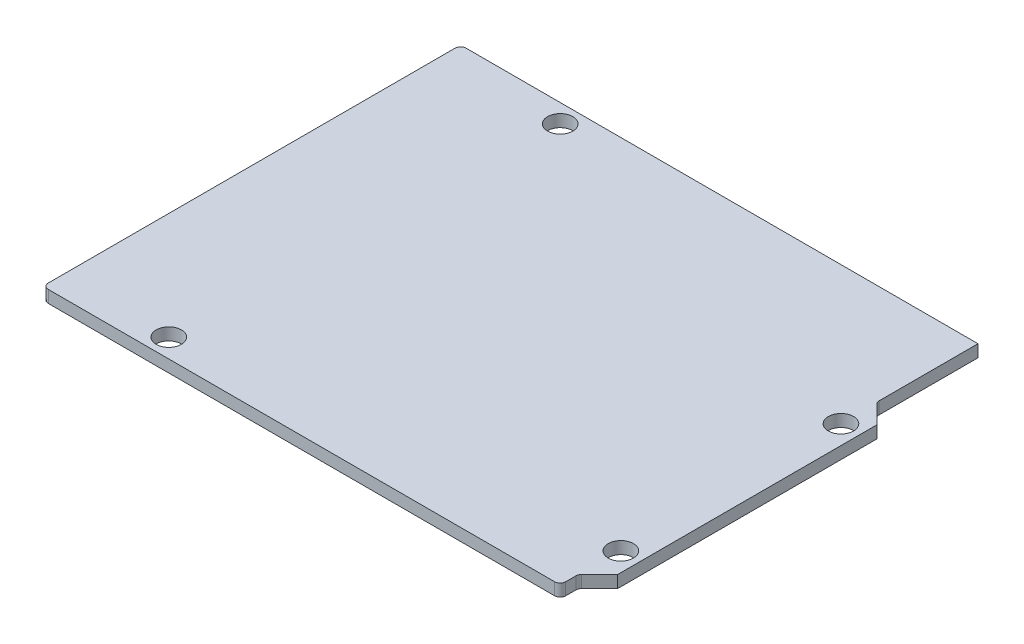
ISO-10303-21;
HEADER;
FILE_DESCRIPTION(('STEP AP214'),'2;1');
FILE_NAME('part.step','',(''),(''),'','','');
FILE_SCHEMA(('AUTOMOTIVE_DESIGN { 1 0 10303 214 1 1 1 1 }'));
ENDSEC;
DATA;
#1=APPLICATION_CONTEXT('core data for automotive mechanical design processes');
#2=APPLICATION_PROTOCOL_DEFINITION('international standard','automotive_design',2000,#1);
#3=PRODUCT_CONTEXT('',#1,'mechanical');
#4=PRODUCT('Part','Part','',(#3));
#5=PRODUCT_RELATED_PRODUCT_CATEGORY('part','',(#4));
#6=PRODUCT_DEFINITION_FORMATION('','',#4);
#7=PRODUCT_DEFINITION_CONTEXT('part definition',#1,'design');
#8=PRODUCT_DEFINITION('design','',#6,#7);
#9=PRODUCT_DEFINITION_SHAPE('','',#8);
#10=(LENGTH_UNIT() NAMED_UNIT(*) SI_UNIT(.MILLI.,.METRE.));
#11=(NAMED_UNIT(*) PLANE_ANGLE_UNIT() SI_UNIT($,.RADIAN.));
#12=(NAMED_UNIT(*) SI_UNIT($,.STERADIAN.) SOLID_ANGLE_UNIT());
#13=UNCERTAINTY_MEASURE_WITH_UNIT(LENGTH_MEASURE(1.E-05),#10,'distance_accuracy_value','');
#14=(GEOMETRIC_REPRESENTATION_CONTEXT(3) GLOBAL_UNCERTAINTY_ASSIGNED_CONTEXT((#13)) GLOBAL_UNIT_ASSIGNED_CONTEXT((#10,
#11,#12)) REPRESENTATION_CONTEXT('',''));
#15=CARTESIAN_POINT('',(0.,0.,0.));
#16=DIRECTION('',(0.,0.,1.));
#17=DIRECTION('',(1.,0.,0.));
#18=AXIS2_PLACEMENT_3D('',#15,#16,#17);
#19=CARTESIAN_POINT('',(0.,1.55,0.));
#20=DIRECTION('',(0.,-1.,0.));
#21=DIRECTION('',(0.,0.,-1.));
#22=AXIS2_PLACEMENT_3D('',#19,#20,#21);
#23=PLANE('',#22);
#24=CARTESIAN_POINT('',(65.8,1.55,-7.6));
#25=DIRECTION('',(0.,1.,0.));
#26=DIRECTION('',(0.,0.,1.));
#27=AXIS2_PLACEMENT_3D('',#24,#25,#26);
#28=CIRCLE('',#27,1.60000000000001);
#29=CARTESIAN_POINT('',(65.8,1.55,-9.2));
#30=VERTEX_POINT('',#29);
#31=EDGE_CURVE('E370',#30,#30,#28,.T.);
#32=ORIENTED_EDGE('',*,*,#31,.F.);
#33=EDGE_LOOP('',(#32));
#34=FACE_BOUND('',#33,.T.);
#35=CARTESIAN_POINT('',(15.,1.55,-50.7));
#36=DIRECTION('',(0.,1.,0.));
#37=DIRECTION('',(0.,0.,1.));
#38=AXIS2_PLACEMENT_3D('',#35,#36,#37);
#39=CIRCLE('',#38,1.6);
#40=CARTESIAN_POINT('',(15.,1.55,-52.3));
#41=VERTEX_POINT('',#40);
#42=EDGE_CURVE('E186',#41,#41,#39,.T.);
#43=ORIENTED_EDGE('',*,*,#42,.F.);
#44=EDGE_LOOP('',(#43));
#45=FACE_BOUND('',#44,.T.);
#46=DIRECTION('',(1.,0.,0.));
#47=VECTOR('',#46,1.);
#48=CARTESIAN_POINT('',(0.,1.55,0.));
#49=LINE('',#48,#47);
#50=CARTESIAN_POINT('',(0.7,1.55,0.));
#51=VERTEX_POINT('',#50);
#52=CARTESIAN_POINT('',(65.,1.55,0.));
#53=VERTEX_POINT('',#52);
#54=EDGE_CURVE('E336',#51,#53,#49,.T.);
#55=ORIENTED_EDGE('',*,*,#54,.T.);
#56=CARTESIAN_POINT('',(65.,1.55,-0.7));
#57=DIRECTION('',(0.,-1.,0.));
#58=DIRECTION('',(0.,0.,-1.));
#59=AXIS2_PLACEMENT_3D('',#56,#57,#58);
#60=CIRCLE('',#59,0.7);
#61=CARTESIAN_POINT('',(65.7,1.55,-0.7));
#62=VERTEX_POINT('',#61);
#63=EDGE_CURVE('E252',#53,#62,#60,.F.);
#64=ORIENTED_EDGE('',*,*,#63,.T.);
#65=DIRECTION('',(0.,0.,-1.));
#66=VECTOR('',#65,1.);
#67=CARTESIAN_POINT('',(65.7,1.55,-2.3));
#68=LINE('',#67,#66);
#69=CARTESIAN_POINT('',(65.7,1.55,-2.01005050633884));
#70=VERTEX_POINT('',#69);
#71=EDGE_CURVE('E150',#62,#70,#68,.T.);
#72=ORIENTED_EDGE('',*,*,#71,.T.);
#73=CARTESIAN_POINT('',(66.4,1.55,-2.01005050633884));
#74=DIRECTION('',(0.,-1.,0.));
#75=DIRECTION('',(0.,0.,-1.));
#76=AXIS2_PLACEMENT_3D('',#73,#74,#75);
#77=CIRCLE('',#76,0.7);
#78=CARTESIAN_POINT('',(65.9050252531694,1.55,-2.50502525316943));
#79=VERTEX_POINT('',#78);
#80=EDGE_CURVE('E11',#70,#79,#77,.T.);
#81=ORIENTED_EDGE('',*,*,#80,.T.);
#82=DIRECTION('',(0.707106781186549,0.,-0.707106781186546));
#83=VECTOR('',#82,1.);
#84=CARTESIAN_POINT('',(68.2,1.55,-4.79999999999999));
#85=LINE('',#84,#83);
#86=CARTESIAN_POINT('',(68.2,1.55,-4.79999999999999));
#87=VERTEX_POINT('',#86);
#88=EDGE_CURVE('E136',#79,#87,#85,.T.);
#89=ORIENTED_EDGE('',*,*,#88,.T.);
#90=DIRECTION('',(0.,0.,-1.));
#91=VECTOR('',#90,1.);
#92=CARTESIAN_POINT('',(68.2,1.55,-4.79999999999999));
#93=LINE('',#92,#91);
#94=CARTESIAN_POINT('',(68.2,1.55,-37.7));
#95=VERTEX_POINT('',#94);
#96=EDGE_CURVE('E142',#87,#95,#93,.T.);
#97=ORIENTED_EDGE('',*,*,#96,.T.);
#98=DIRECTION('',(-0.707106781186548,0.,-0.707106781186546));
#99=VECTOR('',#98,1.);
#100=CARTESIAN_POINT('',(65.7,1.55,-40.2));
#101=LINE('',#100,#99);
#102=CARTESIAN_POINT('',(65.9050252531694,1.55,-39.9949747468306));
#103=VERTEX_POINT('',#102);
#104=EDGE_CURVE('E167',#95,#103,#101,.T.);
#105=ORIENTED_EDGE('',*,*,#104,.T.);
#106=CARTESIAN_POINT('',(66.4,1.55,-40.4899494936611));
#107=DIRECTION('',(0.,-1.,0.));
#108=DIRECTION('',(0.,0.,-1.));
#109=AXIS2_PLACEMENT_3D('',#106,#107,#108);
#110=CIRCLE('',#109,0.7);
#111=CARTESIAN_POINT('',(65.7,1.55,-40.4899494936612));
#112=VERTEX_POINT('',#111);
#113=EDGE_CURVE('E265',#103,#112,#110,.T.);
#114=ORIENTED_EDGE('',*,*,#113,.T.);
#115=DIRECTION('',(0.,0.,-1.));
#116=VECTOR('',#115,1.);
#117=CARTESIAN_POINT('',(65.7,1.55,-53.05));
#118=LINE('',#117,#116);
#119=CARTESIAN_POINT('',(65.7,1.55,-53.05));
#120=VERTEX_POINT('',#119);
#121=EDGE_CURVE('E172',#112,#120,#118,.T.);
#122=ORIENTED_EDGE('',*,*,#121,.T.);
#123=DIRECTION('',(-1.,0.,0.));
#124=VECTOR('',#123,1.);
#125=CARTESIAN_POINT('',(0.,1.55,-53.05));
#126=LINE('',#125,#124);
#127=CARTESIAN_POINT('',(0.7,1.55,-53.05));
#128=VERTEX_POINT('',#127);
#129=EDGE_CURVE('E178',#120,#128,#126,.T.);
#130=ORIENTED_EDGE('',*,*,#129,.T.);
#131=CARTESIAN_POINT('',(0.7,1.55,-52.35));
#132=DIRECTION('',(0.,-1.,0.));
#133=DIRECTION('',(0.,0.,-1.));
#134=AXIS2_PLACEMENT_3D('',#131,#132,#133);
#135=CIRCLE('',#134,0.7);
#136=CARTESIAN_POINT('',(0.,1.55,-52.35));
#137=VERTEX_POINT('',#136);
#138=EDGE_CURVE('E249',#128,#137,#135,.F.);
#139=ORIENTED_EDGE('',*,*,#138,.T.);
#140=DIRECTION('',(0.,0.,1.));
#141=VECTOR('',#140,1.);
#142=CARTESIAN_POINT('',(0.,1.55,0.));
#143=LINE('',#142,#141);
#144=CARTESIAN_POINT('',(0.,1.55,-0.7));
#145=VERTEX_POINT('',#144);
#146=EDGE_CURVE('E208',#137,#145,#143,.T.);
#147=ORIENTED_EDGE('',*,*,#146,.T.);
#148=CARTESIAN_POINT('',(0.7,1.55,-0.7));
#149=DIRECTION('',(0.,-1.,0.));
#150=DIRECTION('',(0.,0.,-1.));
#151=AXIS2_PLACEMENT_3D('',#148,#149,#150);
#152=CIRCLE('',#151,0.7);
#153=EDGE_CURVE('E246',#145,#51,#152,.F.);
#154=ORIENTED_EDGE('',*,*,#153,.T.);
#155=EDGE_LOOP('',(#55,#64,#72,#81,#89,#97,#105,#114,#122,#130,#139,#147,#154));
#156=FACE_BOUND('',#155,.T.);
#157=CARTESIAN_POINT('',(13.6,1.55,-2.4));
#158=DIRECTION('',(0.,1.,0.));
#159=DIRECTION('',(0.,0.,1.));
#160=AXIS2_PLACEMENT_3D('',#157,#158,#159);
#161=CIRCLE('',#160,1.6);
#162=CARTESIAN_POINT('',(13.6,1.55,-4.));
#163=VERTEX_POINT('',#162);
#164=EDGE_CURVE('E362',#163,#163,#161,.T.);
#165=ORIENTED_EDGE('',*,*,#164,.F.);
#166=EDGE_LOOP('',(#165));
#167=FACE_BOUND('',#166,.T.);
#168=CARTESIAN_POINT('',(65.8,1.55,-35.55));
#169=DIRECTION('',(0.,1.,0.));
#170=DIRECTION('',(0.,0.,1.));
#171=AXIS2_PLACEMENT_3D('',#168,#169,#170);
#172=CIRCLE('',#171,1.60000000000001);
#173=CARTESIAN_POINT('',(65.8,1.55,-37.15));
#174=VERTEX_POINT('',#173);
#175=EDGE_CURVE('E378',#174,#174,#172,.T.);
#176=ORIENTED_EDGE('',*,*,#175,.F.);
#177=EDGE_LOOP('',(#176));
#178=FACE_BOUND('',#177,.T.);
#179=ADVANCED_FACE('F38',(#34,#45,#156,#167,#178),#23,.F.);
#180=CARTESIAN_POINT('',(0.,0.,0.));
#181=DIRECTION('',(0.,-1.,0.));
#182=DIRECTION('',(0.,0.,-1.));
#183=AXIS2_PLACEMENT_3D('',#180,#181,#182);
#184=PLANE('',#183);
#185=CARTESIAN_POINT('',(65.8,0.,-7.6));
#186=DIRECTION('',(0.,1.,0.));
#187=DIRECTION('',(0.,0.,1.));
#188=AXIS2_PLACEMENT_3D('',#185,#186,#187);
#189=CIRCLE('',#188,1.60000000000001);
#190=CARTESIAN_POINT('',(65.8,0.,-9.2));
#191=VERTEX_POINT('',#190);
#192=EDGE_CURVE('E374',#191,#191,#189,.T.);
#193=ORIENTED_EDGE('',*,*,#192,.T.);
#194=EDGE_LOOP('',(#193));
#195=FACE_BOUND('',#194,.T.);
#196=CARTESIAN_POINT('',(15.,0.,-50.7));
#197=DIRECTION('',(0.,1.,0.));
#198=DIRECTION('',(0.,0.,1.));
#199=AXIS2_PLACEMENT_3D('',#196,#197,#198);
#200=CIRCLE('',#199,1.6);
#201=CARTESIAN_POINT('',(15.,0.,-52.3));
#202=VERTEX_POINT('',#201);
#203=EDGE_CURVE('E358',#202,#202,#200,.T.);
#204=ORIENTED_EDGE('',*,*,#203,.T.);
#205=EDGE_LOOP('',(#204));
#206=FACE_BOUND('',#205,.T.);
#207=DIRECTION('',(0.,0.,-1.));
#208=VECTOR('',#207,1.);
#209=CARTESIAN_POINT('',(65.7,0.,-2.3));
#210=LINE('',#209,#208);
#211=CARTESIAN_POINT('',(65.7,0.,-0.7));
#212=VERTEX_POINT('',#211);
#213=CARTESIAN_POINT('',(65.7,0.,-2.01005050633884));
#214=VERTEX_POINT('',#213);
#215=EDGE_CURVE('E190',#212,#214,#210,.T.);
#216=ORIENTED_EDGE('',*,*,#215,.F.);
#217=CARTESIAN_POINT('',(65.,0.,-0.7));
#218=DIRECTION('',(0.,-1.,0.));
#219=DIRECTION('',(0.,0.,-1.));
#220=AXIS2_PLACEMENT_3D('',#217,#218,#219);
#221=CIRCLE('',#220,0.7);
#222=CARTESIAN_POINT('',(65.,0.,0.));
#223=VERTEX_POINT('',#222);
#224=EDGE_CURVE('E236',#212,#223,#221,.T.);
#225=ORIENTED_EDGE('',*,*,#224,.T.);
#226=DIRECTION('',(1.,0.,0.));
#227=VECTOR('',#226,1.);
#228=CARTESIAN_POINT('',(0.,0.,0.));
#229=LINE('',#228,#227);
#230=CARTESIAN_POINT('',(0.7,0.,0.));
#231=VERTEX_POINT('',#230);
#232=EDGE_CURVE('E185',#231,#223,#229,.T.);
#233=ORIENTED_EDGE('',*,*,#232,.F.);
#234=CARTESIAN_POINT('',(0.7,0.,-0.7));
#235=DIRECTION('',(0.,-1.,0.));
#236=DIRECTION('',(0.,0.,-1.));
#237=AXIS2_PLACEMENT_3D('',#234,#235,#236);
#238=CIRCLE('',#237,0.7);
#239=CARTESIAN_POINT('',(0.,0.,-0.7));
#240=VERTEX_POINT('',#239);
#241=EDGE_CURVE('E230',#231,#240,#238,.T.);
#242=ORIENTED_EDGE('',*,*,#241,.T.);
#243=DIRECTION('',(0.,0.,1.));
#244=VECTOR('',#243,1.);
#245=CARTESIAN_POINT('',(0.,0.,0.));
#246=LINE('',#245,#244);
#247=CARTESIAN_POINT('',(0.,0.,-52.35));
#248=VERTEX_POINT('',#247);
#249=EDGE_CURVE('E182',#248,#240,#246,.T.);
#250=ORIENTED_EDGE('',*,*,#249,.F.);
#251=CARTESIAN_POINT('',(0.7,0.,-52.35));
#252=DIRECTION('',(0.,-1.,0.));
#253=DIRECTION('',(0.,0.,-1.));
#254=AXIS2_PLACEMENT_3D('',#251,#252,#253);
#255=CIRCLE('',#254,0.7);
#256=CARTESIAN_POINT('',(0.7,0.,-53.05));
#257=VERTEX_POINT('',#256);
#258=EDGE_CURVE('E233',#248,#257,#255,.T.);
#259=ORIENTED_EDGE('',*,*,#258,.T.);
#260=DIRECTION('',(-1.,0.,0.));
#261=VECTOR('',#260,1.);
#262=CARTESIAN_POINT('',(0.,0.,-53.05));
#263=LINE('',#262,#261);
#264=CARTESIAN_POINT('',(65.7,0.,-53.05));
#265=VERTEX_POINT('',#264);
#266=EDGE_CURVE('E205',#265,#257,#263,.T.);
#267=ORIENTED_EDGE('',*,*,#266,.F.);
#268=DIRECTION('',(0.,0.,-1.));
#269=VECTOR('',#268,1.);
#270=CARTESIAN_POINT('',(65.7,0.,-53.05));
#271=LINE('',#270,#269);
#272=CARTESIAN_POINT('',(65.7,0.,-40.4899494936612));
#273=VERTEX_POINT('',#272);
#274=EDGE_CURVE('E202',#273,#265,#271,.T.);
#275=ORIENTED_EDGE('',*,*,#274,.F.);
#276=CARTESIAN_POINT('',(66.4,0.,-40.4899494936611));
#277=DIRECTION('',(0.,-1.,0.));
#278=DIRECTION('',(0.,0.,-1.));
#279=AXIS2_PLACEMENT_3D('',#276,#277,#278);
#280=CIRCLE('',#279,0.7);
#281=CARTESIAN_POINT('',(65.9050252531694,0.,-39.9949747468306));
#282=VERTEX_POINT('',#281);
#283=EDGE_CURVE('E263',#273,#282,#280,.F.);
#284=ORIENTED_EDGE('',*,*,#283,.T.);
#285=DIRECTION('',(-0.707106781186548,0.,-0.707106781186546));
#286=VECTOR('',#285,1.);
#287=CARTESIAN_POINT('',(65.7,0.,-40.2));
#288=LINE('',#287,#286);
#289=CARTESIAN_POINT('',(68.2,0.,-37.7));
#290=VERTEX_POINT('',#289);
#291=EDGE_CURVE('E198',#290,#282,#288,.T.);
#292=ORIENTED_EDGE('',*,*,#291,.F.);
#293=DIRECTION('',(0.,0.,-1.));
#294=VECTOR('',#293,1.);
#295=CARTESIAN_POINT('',(68.2,0.,-4.79999999999999));
#296=LINE('',#295,#294);
#297=CARTESIAN_POINT('',(68.2,0.,-4.79999999999999));
#298=VERTEX_POINT('',#297);
#299=EDGE_CURVE('E196',#298,#290,#296,.T.);
#300=ORIENTED_EDGE('',*,*,#299,.F.);
#301=DIRECTION('',(0.707106781186549,0.,-0.707106781186546));
#302=VECTOR('',#301,1.);
#303=CARTESIAN_POINT('',(68.2,0.,-4.79999999999999));
#304=LINE('',#303,#302);
#305=CARTESIAN_POINT('',(65.9050252531694,0.,-2.50502525316943));
#306=VERTEX_POINT('',#305);
#307=EDGE_CURVE('E156',#306,#298,#304,.T.);
#308=ORIENTED_EDGE('',*,*,#307,.F.);
#309=CARTESIAN_POINT('',(66.4,0.,-2.01005050633884));
#310=DIRECTION('',(0.,-1.,0.));
#311=DIRECTION('',(0.,0.,-1.));
#312=AXIS2_PLACEMENT_3D('',#309,#310,#311);
#313=CIRCLE('',#312,0.7);
#314=EDGE_CURVE('E47',#306,#214,#313,.F.);
#315=ORIENTED_EDGE('',*,*,#314,.T.);
#316=EDGE_LOOP('',(#216,#225,#233,#242,#250,#259,#267,#275,#284,#292,#300,#308,#315));
#317=FACE_BOUND('',#316,.T.);
#318=CARTESIAN_POINT('',(13.6,0.,-2.4));
#319=DIRECTION('',(0.,1.,0.));
#320=DIRECTION('',(0.,0.,1.));
#321=AXIS2_PLACEMENT_3D('',#318,#319,#320);
#322=CIRCLE('',#321,1.6);
#323=CARTESIAN_POINT('',(13.6,0.,-4.));
#324=VERTEX_POINT('',#323);
#325=EDGE_CURVE('E366',#324,#324,#322,.T.);
#326=ORIENTED_EDGE('',*,*,#325,.T.);
#327=EDGE_LOOP('',(#326));
#328=FACE_BOUND('',#327,.T.);
#329=CARTESIAN_POINT('',(65.8,0.,-35.55));
#330=DIRECTION('',(0.,1.,0.));
#331=DIRECTION('',(0.,0.,1.));
#332=AXIS2_PLACEMENT_3D('',#329,#330,#331);
#333=CIRCLE('',#332,1.60000000000001);
#334=CARTESIAN_POINT('',(65.8,0.,-37.15));
#335=VERTEX_POINT('',#334);
#336=EDGE_CURVE('E382',#335,#335,#333,.T.);
#337=ORIENTED_EDGE('',*,*,#336,.T.);
#338=EDGE_LOOP('',(#337));
#339=FACE_BOUND('',#338,.T.);
#340=ADVANCED_FACE('F270',(#195,#206,#317,#328,#339),#184,.T.);
#341=CARTESIAN_POINT('',(0.,1.55,0.));
#342=DIRECTION('',(1.,0.,0.));
#343=DIRECTION('',(0.,0.,-1.));
#344=AXIS2_PLACEMENT_3D('',#341,#342,#343);
#345=PLANE('',#344);
#346=ORIENTED_EDGE('',*,*,#146,.F.);
#347=DIRECTION('',(0.,-1.,0.));
#348=VECTOR('',#347,1.);
#349=CARTESIAN_POINT('',(0.,1.55,-52.35));
#350=LINE('',#349,#348);
#351=EDGE_CURVE('E257',#137,#248,#350,.T.);
#352=ORIENTED_EDGE('',*,*,#351,.T.);
#353=ORIENTED_EDGE('',*,*,#249,.T.);
#354=DIRECTION('',(0.,-1.,0.));
#355=VECTOR('',#354,1.);
#356=CARTESIAN_POINT('',(0.,1.55,-0.7));
#357=LINE('',#356,#355);
#358=EDGE_CURVE('E62',#240,#145,#357,.F.);
#359=ORIENTED_EDGE('',*,*,#358,.T.);
#360=EDGE_LOOP('',(#346,#352,#353,#359));
#361=FACE_BOUND('',#360,.T.);
#362=ADVANCED_FACE('F299',(#361),#345,.F.);
#363=CARTESIAN_POINT('',(0.,1.55,0.));
#364=DIRECTION('',(0.,0.,-1.));
#365=DIRECTION('',(-1.,0.,0.));
#366=AXIS2_PLACEMENT_3D('',#363,#364,#365);
#367=PLANE('',#366);
#368=ORIENTED_EDGE('',*,*,#232,.T.);
#369=DIRECTION('',(0.,-1.,0.));
#370=VECTOR('',#369,1.);
#371=CARTESIAN_POINT('',(65.,1.55,0.));
#372=LINE('',#371,#370);
#373=EDGE_CURVE('E243',#223,#53,#372,.F.);
#374=ORIENTED_EDGE('',*,*,#373,.T.);
#375=ORIENTED_EDGE('',*,*,#54,.F.);
#376=DIRECTION('',(0.,-1.,0.));
#377=VECTOR('',#376,1.);
#378=CARTESIAN_POINT('',(0.7,1.55,0.));
#379=LINE('',#378,#377);
#380=EDGE_CURVE('E239',#51,#231,#379,.T.);
#381=ORIENTED_EDGE('',*,*,#380,.T.);
#382=EDGE_LOOP('',(#368,#374,#375,#381));
#383=FACE_BOUND('',#382,.T.);
#384=ADVANCED_FACE('F325',(#383),#367,.F.);
#385=CARTESIAN_POINT('',(65.7,1.55,-2.3));
#386=DIRECTION('',(-1.,0.,0.));
#387=DIRECTION('',(0.,0.,1.));
#388=AXIS2_PLACEMENT_3D('',#385,#386,#387);
#389=PLANE('',#388);
#390=ORIENTED_EDGE('',*,*,#215,.T.);
#391=DIRECTION('',(0.,-1.,0.));
#392=VECTOR('',#391,1.);
#393=CARTESIAN_POINT('',(65.7,1.55,-2.01005050633884));
#394=LINE('',#393,#392);
#395=EDGE_CURVE('E227',#214,#70,#394,.F.);
#396=ORIENTED_EDGE('',*,*,#395,.T.);
#397=ORIENTED_EDGE('',*,*,#71,.F.);
#398=DIRECTION('',(0.,-1.,0.));
#399=VECTOR('',#398,1.);
#400=CARTESIAN_POINT('',(65.7,1.55,-0.7));
#401=LINE('',#400,#399);
#402=EDGE_CURVE('E223',#62,#212,#401,.T.);
#403=ORIENTED_EDGE('',*,*,#402,.T.);
#404=EDGE_LOOP('',(#390,#396,#397,#403));
#405=FACE_BOUND('',#404,.T.);
#406=ADVANCED_FACE('F275',(#405),#389,.F.);
#407=CARTESIAN_POINT('',(68.2,1.55,-4.79999999999999));
#408=DIRECTION('',(-0.707106781186546,0.,-0.707106781186549));
#409=DIRECTION('',(-0.707106781186549,0.,0.707106781186546));
#410=AXIS2_PLACEMENT_3D('',#407,#408,#409);
#411=PLANE('',#410);
#412=ORIENTED_EDGE('',*,*,#88,.F.);
#413=DIRECTION('',(0.,-1.,0.));
#414=VECTOR('',#413,1.);
#415=CARTESIAN_POINT('',(65.9050252531694,0.,-2.50502525316943));
#416=LINE('',#415,#414);
#417=EDGE_CURVE('E220',#79,#306,#416,.T.);
#418=ORIENTED_EDGE('',*,*,#417,.T.);
#419=ORIENTED_EDGE('',*,*,#307,.T.);
#420=DIRECTION('',(0.,-1.,0.));
#421=VECTOR('',#420,1.);
#422=CARTESIAN_POINT('',(68.2,1.55,-4.79999999999999));
#423=LINE('',#422,#421);
#424=EDGE_CURVE('E153',#87,#298,#423,.T.);
#425=ORIENTED_EDGE('',*,*,#424,.F.);
#426=EDGE_LOOP('',(#412,#418,#419,#425));
#427=FACE_BOUND('',#426,.T.);
#428=ADVANCED_FACE('F154',(#427),#411,.F.);
#429=CARTESIAN_POINT('',(68.2,1.55,-4.79999999999999));
#430=DIRECTION('',(-1.,0.,0.));
#431=DIRECTION('',(0.,0.,1.));
#432=AXIS2_PLACEMENT_3D('',#429,#430,#431);
#433=PLANE('',#432);
#434=ORIENTED_EDGE('',*,*,#299,.T.);
#435=DIRECTION('',(0.,-1.,0.));
#436=VECTOR('',#435,1.);
#437=CARTESIAN_POINT('',(68.2,1.55,-37.7));
#438=LINE('',#437,#436);
#439=EDGE_CURVE('E161',#95,#290,#438,.T.);
#440=ORIENTED_EDGE('',*,*,#439,.F.);
#441=ORIENTED_EDGE('',*,*,#96,.F.);
#442=ORIENTED_EDGE('',*,*,#424,.T.);
#443=EDGE_LOOP('',(#434,#440,#441,#442));
#444=FACE_BOUND('',#443,.T.);
#445=ADVANCED_FACE('F163',(#444),#433,.F.);
#446=CARTESIAN_POINT('',(65.7,1.55,-40.2));
#447=DIRECTION('',(-0.707106781186546,0.,0.707106781186549));
#448=DIRECTION('',(0.707106781186549,0.,0.707106781186546));
#449=AXIS2_PLACEMENT_3D('',#446,#447,#448);
#450=PLANE('',#449);
#451=ORIENTED_EDGE('',*,*,#291,.T.);
#452=DIRECTION('',(0.,-1.,0.));
#453=VECTOR('',#452,1.);
#454=CARTESIAN_POINT('',(65.9050252531694,1.55,-39.9949747468306));
#455=LINE('',#454,#453);
#456=EDGE_CURVE('E217',#282,#103,#455,.F.);
#457=ORIENTED_EDGE('',*,*,#456,.T.);
#458=ORIENTED_EDGE('',*,*,#104,.F.);
#459=ORIENTED_EDGE('',*,*,#439,.T.);
#460=EDGE_LOOP('',(#451,#457,#458,#459));
#461=FACE_BOUND('',#460,.T.);
#462=ADVANCED_FACE('F314',(#461),#450,.F.);
#463=CARTESIAN_POINT('',(65.7,1.55,-53.05));
#464=DIRECTION('',(-1.,0.,0.));
#465=DIRECTION('',(0.,0.,1.));
#466=AXIS2_PLACEMENT_3D('',#463,#464,#465);
#467=PLANE('',#466);
#468=ORIENTED_EDGE('',*,*,#121,.F.);
#469=DIRECTION('',(0.,-1.,0.));
#470=VECTOR('',#469,1.);
#471=CARTESIAN_POINT('',(65.7,0.,-40.4899494936611));
#472=LINE('',#471,#470);
#473=EDGE_CURVE('E160',#112,#273,#472,.T.);
#474=ORIENTED_EDGE('',*,*,#473,.T.);
#475=ORIENTED_EDGE('',*,*,#274,.T.);
#476=DIRECTION('',(0.,-1.,0.));
#477=VECTOR('',#476,1.);
#478=CARTESIAN_POINT('',(65.7,1.55,-53.05));
#479=LINE('',#478,#477);
#480=EDGE_CURVE('E181',#120,#265,#479,.T.);
#481=ORIENTED_EDGE('',*,*,#480,.F.);
#482=EDGE_LOOP('',(#468,#474,#475,#481));
#483=FACE_BOUND('',#482,.T.);
#484=ADVANCED_FACE('F311',(#483),#467,.F.);
#485=CARTESIAN_POINT('',(0.,1.55,-53.05));
#486=DIRECTION('',(0.,0.,1.));
#487=DIRECTION('',(1.,0.,0.));
#488=AXIS2_PLACEMENT_3D('',#485,#486,#487);
#489=PLANE('',#488);
#490=ORIENTED_EDGE('',*,*,#266,.T.);
#491=DIRECTION('',(0.,-1.,0.));
#492=VECTOR('',#491,1.);
#493=CARTESIAN_POINT('',(0.7,1.55,-53.05));
#494=LINE('',#493,#492);
#495=EDGE_CURVE('E54',#257,#128,#494,.F.);
#496=ORIENTED_EDGE('',*,*,#495,.T.);
#497=ORIENTED_EDGE('',*,*,#129,.F.);
#498=ORIENTED_EDGE('',*,*,#480,.T.);
#499=EDGE_LOOP('',(#490,#496,#497,#498));
#500=FACE_BOUND('',#499,.T.);
#501=ADVANCED_FACE('F308',(#500),#489,.F.);
#502=CARTESIAN_POINT('',(15.,1.55,-50.7));
#503=DIRECTION('',(0.,-1.,0.));
#504=DIRECTION('',(0.,0.,-1.));
#505=AXIS2_PLACEMENT_3D('',#502,#503,#504);
#506=CYLINDRICAL_SURFACE('',#505,1.6);
#507=CARTESIAN_POINT('',(15.,1.55,-52.3));
#508=CARTESIAN_POINT('',(15.,1.53385416666667,-52.3));
#509=CARTESIAN_POINT('',(15.,1.51770833333333,-52.3));
#510=CARTESIAN_POINT('',(15.,1.48541666666667,-52.3));
#511=CARTESIAN_POINT('',(15.,1.46927083333333,-52.3));
#512=CARTESIAN_POINT('',(15.,1.43697916666667,-52.3));
#513=CARTESIAN_POINT('',(15.,1.42083333333333,-52.3));
#514=CARTESIAN_POINT('',(15.,1.38854166666667,-52.3));
#515=CARTESIAN_POINT('',(15.,1.37239583333333,-52.3));
#516=CARTESIAN_POINT('',(15.,1.34010416666667,-52.3));
#517=CARTESIAN_POINT('',(15.,1.32395833333333,-52.3));
#518=CARTESIAN_POINT('',(15.,1.29166666666667,-52.3));
#519=CARTESIAN_POINT('',(15.,1.27552083333333,-52.3));
#520=CARTESIAN_POINT('',(15.,1.24322916666667,-52.3));
#521=CARTESIAN_POINT('',(15.,1.22708333333333,-52.3));
#522=CARTESIAN_POINT('',(15.,1.19479166666667,-52.3));
#523=CARTESIAN_POINT('',(15.,1.17864583333333,-52.3));
#524=CARTESIAN_POINT('',(15.,1.14635416666667,-52.3));
#525=CARTESIAN_POINT('',(15.,1.13020833333333,-52.3));
#526=CARTESIAN_POINT('',(15.,1.09791666666667,-52.3));
#527=CARTESIAN_POINT('',(15.,1.08177083333333,-52.3));
#528=CARTESIAN_POINT('',(15.,1.04947916666667,-52.3));
#529=CARTESIAN_POINT('',(15.,1.03333333333333,-52.3));
#530=CARTESIAN_POINT('',(15.,1.00104166666667,-52.3));
#531=CARTESIAN_POINT('',(15.,0.984895833333333,-52.3));
#532=CARTESIAN_POINT('',(15.,0.952604166666667,-52.3));
#533=CARTESIAN_POINT('',(15.,0.936458333333333,-52.3));
#534=CARTESIAN_POINT('',(15.,0.904166666666667,-52.3));
#535=CARTESIAN_POINT('',(15.,0.888020833333333,-52.3));
#536=CARTESIAN_POINT('',(15.,0.855729166666667,-52.3));
#537=CARTESIAN_POINT('',(15.,0.839583333333333,-52.3));
#538=CARTESIAN_POINT('',(15.,0.807291666666667,-52.3));
#539=CARTESIAN_POINT('',(15.,0.791145833333333,-52.3));
#540=CARTESIAN_POINT('',(15.,0.758854166666667,-52.3));
#541=CARTESIAN_POINT('',(15.,0.742708333333333,-52.3));
#542=CARTESIAN_POINT('',(15.,0.710416666666667,-52.3));
#543=CARTESIAN_POINT('',(15.,0.694270833333333,-52.3));
#544=CARTESIAN_POINT('',(15.,0.661979166666667,-52.3));
#545=CARTESIAN_POINT('',(15.,0.645833333333333,-52.3));
#546=CARTESIAN_POINT('',(15.,0.613541666666667,-52.3));
#547=CARTESIAN_POINT('',(15.,0.597395833333333,-52.3));
#548=CARTESIAN_POINT('',(15.,0.565104166666667,-52.3));
#549=CARTESIAN_POINT('',(15.,0.548958333333333,-52.3));
#550=CARTESIAN_POINT('',(15.,0.516666666666667,-52.3));
#551=CARTESIAN_POINT('',(15.,0.500520833333333,-52.3));
#552=CARTESIAN_POINT('',(15.,0.468229166666667,-52.3));
#553=CARTESIAN_POINT('',(15.,0.452083333333333,-52.3));
#554=CARTESIAN_POINT('',(15.,0.419791666666667,-52.3));
#555=CARTESIAN_POINT('',(15.,0.403645833333333,-52.3));
#556=CARTESIAN_POINT('',(15.,0.371354166666667,-52.3));
#557=CARTESIAN_POINT('',(15.,0.355208333333333,-52.3));
#558=CARTESIAN_POINT('',(15.,0.322916666666667,-52.3));
#559=CARTESIAN_POINT('',(15.,0.306770833333333,-52.3));
#560=CARTESIAN_POINT('',(15.,0.274479166666667,-52.3));
#561=CARTESIAN_POINT('',(15.,0.258333333333333,-52.3));
#562=CARTESIAN_POINT('',(15.,0.226041666666667,-52.3));
#563=CARTESIAN_POINT('',(15.,0.209895833333333,-52.3));
#564=CARTESIAN_POINT('',(15.,0.177604166666667,-52.3));
#565=CARTESIAN_POINT('',(15.,0.161458333333333,-52.3));
#566=CARTESIAN_POINT('',(15.,0.129166666666667,-52.3));
#567=CARTESIAN_POINT('',(15.,0.113020833333333,-52.3));
#568=CARTESIAN_POINT('',(15.,0.0807291666666667,-52.3));
#569=CARTESIAN_POINT('',(15.,0.0645833333333334,-52.3));
#570=CARTESIAN_POINT('',(15.,0.0322916666666667,-52.3));
#571=CARTESIAN_POINT('',(15.,0.0161458333333334,-52.3));
#572=CARTESIAN_POINT('',(15.,0.,-52.3));
#573=B_SPLINE_CURVE_WITH_KNOTS('',3,(#507,#508,#509,#510,#511,#512,#513,#514,#515,#516,#517,
#518,#519,#520,#521,#522,#523,#524,#525,#526,#527,#528,#529,#530,#531,#532,#533,#534,#535,#536,
#537,#538,#539,#540,#541,#542,#543,#544,#545,#546,#547,#548,#549,#550,#551,#552,#553,#554,#555,
#556,#557,#558,#559,#560,#561,#562,#563,#564,#565,#566,#567,#568,#569,#570,#571,#572),
.UNSPECIFIED.,.F.,.F.,(4,2,2,2,2,2,2,2,2,2,2,2,2,2,2,2,2,2,2,2,2,2,2,2,2,2,2,2,2,2,2,2,4),(0.,
0.0484374999999999,0.096875,0.1453125,0.19375,0.2421875,0.290625,0.3390625,0.3875,0.4359375,
0.484375,0.5328125,0.58125,0.6296875,0.678125,0.7265625,0.775,0.8234375,0.871875,0.9203125,
0.96875,1.0171875,1.065625,1.1140625,1.1625,1.2109375,1.259375,1.3078125,1.35625,1.4046875,
1.453125,1.5015625,1.55),.UNSPECIFIED.);
#574=EDGE_CURVE('BSEAM305',#41,#202,#573,.T.);
#575=ORIENTED_EDGE('',*,*,#42,.T.);
#576=ORIENTED_EDGE('',*,*,#203,.F.);
#577=ORIENTED_EDGE('',*,*,#574,.T.);
#578=ORIENTED_EDGE('',*,*,#574,.F.);
#579=EDGE_LOOP('',(#575,#577,#576,#578));
#580=FACE_BOUND('',#579,.T.);
#581=ADVANCED_FACE('F305',(#580),#506,.F.);
#582=CARTESIAN_POINT('',(13.6,1.55,-2.4));
#583=DIRECTION('',(0.,-1.,0.));
#584=DIRECTION('',(0.,0.,-1.));
#585=AXIS2_PLACEMENT_3D('',#582,#583,#584);
#586=CYLINDRICAL_SURFACE('',#585,1.6);
#587=CARTESIAN_POINT('',(13.6,1.55,-4.));
#588=CARTESIAN_POINT('',(13.6,1.53385416666667,-4.));
#589=CARTESIAN_POINT('',(13.6,1.51770833333333,-4.));
#590=CARTESIAN_POINT('',(13.6,1.48541666666667,-4.));
#591=CARTESIAN_POINT('',(13.6,1.46927083333333,-4.));
#592=CARTESIAN_POINT('',(13.6,1.43697916666667,-4.));
#593=CARTESIAN_POINT('',(13.6,1.42083333333333,-4.));
#594=CARTESIAN_POINT('',(13.6,1.38854166666667,-4.));
#595=CARTESIAN_POINT('',(13.6,1.37239583333333,-4.));
#596=CARTESIAN_POINT('',(13.6,1.34010416666667,-4.));
#597=CARTESIAN_POINT('',(13.6,1.32395833333333,-4.));
#598=CARTESIAN_POINT('',(13.6,1.29166666666667,-4.));
#599=CARTESIAN_POINT('',(13.6,1.27552083333333,-4.));
#600=CARTESIAN_POINT('',(13.6,1.24322916666667,-4.));
#601=CARTESIAN_POINT('',(13.6,1.22708333333333,-4.));
#602=CARTESIAN_POINT('',(13.6,1.19479166666667,-4.));
#603=CARTESIAN_POINT('',(13.6,1.17864583333333,-4.));
#604=CARTESIAN_POINT('',(13.6,1.14635416666667,-4.));
#605=CARTESIAN_POINT('',(13.6,1.13020833333333,-4.));
#606=CARTESIAN_POINT('',(13.6,1.09791666666667,-4.));
#607=CARTESIAN_POINT('',(13.6,1.08177083333333,-4.));
#608=CARTESIAN_POINT('',(13.6,1.04947916666667,-4.));
#609=CARTESIAN_POINT('',(13.6,1.03333333333333,-4.));
#610=CARTESIAN_POINT('',(13.6,1.00104166666667,-4.));
#611=CARTESIAN_POINT('',(13.6,0.984895833333333,-4.));
#612=CARTESIAN_POINT('',(13.6,0.952604166666667,-4.));
#613=CARTESIAN_POINT('',(13.6,0.936458333333333,-4.));
#614=CARTESIAN_POINT('',(13.6,0.904166666666667,-4.));
#615=CARTESIAN_POINT('',(13.6,0.888020833333333,-4.));
#616=CARTESIAN_POINT('',(13.6,0.855729166666667,-4.));
#617=CARTESIAN_POINT('',(13.6,0.839583333333333,-4.));
#618=CARTESIAN_POINT('',(13.6,0.807291666666667,-4.));
#619=CARTESIAN_POINT('',(13.6,0.791145833333333,-4.));
#620=CARTESIAN_POINT('',(13.6,0.758854166666667,-4.));
#621=CARTESIAN_POINT('',(13.6,0.742708333333333,-4.));
#622=CARTESIAN_POINT('',(13.6,0.710416666666667,-4.));
#623=CARTESIAN_POINT('',(13.6,0.694270833333333,-4.));
#624=CARTESIAN_POINT('',(13.6,0.661979166666667,-4.));
#625=CARTESIAN_POINT('',(13.6,0.645833333333333,-4.));
#626=CARTESIAN_POINT('',(13.6,0.613541666666667,-4.));
#627=CARTESIAN_POINT('',(13.6,0.597395833333333,-4.));
#628=CARTESIAN_POINT('',(13.6,0.565104166666667,-4.));
#629=CARTESIAN_POINT('',(13.6,0.548958333333333,-4.));
#630=CARTESIAN_POINT('',(13.6,0.516666666666667,-4.));
#631=CARTESIAN_POINT('',(13.6,0.500520833333333,-4.));
#632=CARTESIAN_POINT('',(13.6,0.468229166666667,-4.));
#633=CARTESIAN_POINT('',(13.6,0.452083333333333,-4.));
#634=CARTESIAN_POINT('',(13.6,0.419791666666667,-4.));
#635=CARTESIAN_POINT('',(13.6,0.403645833333333,-4.));
#636=CARTESIAN_POINT('',(13.6,0.371354166666667,-4.));
#637=CARTESIAN_POINT('',(13.6,0.355208333333333,-4.));
#638=CARTESIAN_POINT('',(13.6,0.322916666666667,-4.));
#639=CARTESIAN_POINT('',(13.6,0.306770833333333,-4.));
#640=CARTESIAN_POINT('',(13.6,0.274479166666667,-4.));
#641=CARTESIAN_POINT('',(13.6,0.258333333333333,-4.));
#642=CARTESIAN_POINT('',(13.6,0.226041666666667,-4.));
#643=CARTESIAN_POINT('',(13.6,0.209895833333333,-4.));
#644=CARTESIAN_POINT('',(13.6,0.177604166666667,-4.));
#645=CARTESIAN_POINT('',(13.6,0.161458333333333,-4.));
#646=CARTESIAN_POINT('',(13.6,0.129166666666667,-4.));
#647=CARTESIAN_POINT('',(13.6,0.113020833333333,-4.));
#648=CARTESIAN_POINT('',(13.6,0.0807291666666667,-4.));
#649=CARTESIAN_POINT('',(13.6,0.0645833333333334,-4.));
#650=CARTESIAN_POINT('',(13.6,0.0322916666666667,-4.));
#651=CARTESIAN_POINT('',(13.6,0.0161458333333334,-4.));
#652=CARTESIAN_POINT('',(13.6,0.,-4.));
#653=B_SPLINE_CURVE_WITH_KNOTS('',3,(#587,#588,#589,#590,#591,#592,#593,#594,#595,#596,#597,
#598,#599,#600,#601,#602,#603,#604,#605,#606,#607,#608,#609,#610,#611,#612,#613,#614,#615,#616,
#617,#618,#619,#620,#621,#622,#623,#624,#625,#626,#627,#628,#629,#630,#631,#632,#633,#634,#635,
#636,#637,#638,#639,#640,#641,#642,#643,#644,#645,#646,#647,#648,#649,#650,#651,#652),
.UNSPECIFIED.,.F.,.F.,(4,2,2,2,2,2,2,2,2,2,2,2,2,2,2,2,2,2,2,2,2,2,2,2,2,2,2,2,2,2,2,2,4),(0.,
0.0484374999999999,0.096875,0.1453125,0.19375,0.2421875,0.290625,0.3390625,0.3875,0.4359375,
0.484375,0.5328125,0.58125,0.6296875,0.678125,0.7265625,0.775,0.8234375,0.871875,0.9203125,
0.96875,1.0171875,1.065625,1.1140625,1.1625,1.2109375,1.259375,1.3078125,1.35625,1.4046875,
1.453125,1.5015625,1.55),.UNSPECIFIED.);
#654=EDGE_CURVE('BSEAM400',#163,#324,#653,.T.);
#655=ORIENTED_EDGE('',*,*,#164,.T.);
#656=ORIENTED_EDGE('',*,*,#325,.F.);
#657=ORIENTED_EDGE('',*,*,#654,.T.);
#658=ORIENTED_EDGE('',*,*,#654,.F.);
#659=EDGE_LOOP('',(#655,#657,#656,#658));
#660=FACE_BOUND('',#659,.T.);
#661=ADVANCED_FACE('F400',(#660),#586,.F.);
#662=CARTESIAN_POINT('',(65.8,1.55,-7.6));
#663=DIRECTION('',(0.,-1.,0.));
#664=DIRECTION('',(0.,0.,-1.));
#665=AXIS2_PLACEMENT_3D('',#662,#663,#664);
#666=CYLINDRICAL_SURFACE('',#665,1.60000000000001);
#667=CARTESIAN_POINT('',(65.8,1.55,-9.2));
#668=CARTESIAN_POINT('',(65.8,1.53385416666667,-9.2));
#669=CARTESIAN_POINT('',(65.8,1.51770833333333,-9.2));
#670=CARTESIAN_POINT('',(65.8,1.48541666666667,-9.2));
#671=CARTESIAN_POINT('',(65.8,1.46927083333333,-9.2));
#672=CARTESIAN_POINT('',(65.8,1.43697916666667,-9.2));
#673=CARTESIAN_POINT('',(65.8,1.42083333333333,-9.2));
#674=CARTESIAN_POINT('',(65.8,1.38854166666667,-9.2));
#675=CARTESIAN_POINT('',(65.8,1.37239583333333,-9.2));
#676=CARTESIAN_POINT('',(65.8,1.34010416666667,-9.2));
#677=CARTESIAN_POINT('',(65.8,1.32395833333333,-9.2));
#678=CARTESIAN_POINT('',(65.8,1.29166666666667,-9.2));
#679=CARTESIAN_POINT('',(65.8,1.27552083333333,-9.2));
#680=CARTESIAN_POINT('',(65.8,1.24322916666667,-9.2));
#681=CARTESIAN_POINT('',(65.8,1.22708333333333,-9.2));
#682=CARTESIAN_POINT('',(65.8,1.19479166666667,-9.2));
#683=CARTESIAN_POINT('',(65.8,1.17864583333333,-9.2));
#684=CARTESIAN_POINT('',(65.8,1.14635416666667,-9.2));
#685=CARTESIAN_POINT('',(65.8,1.13020833333333,-9.2));
#686=CARTESIAN_POINT('',(65.8,1.09791666666667,-9.2));
#687=CARTESIAN_POINT('',(65.8,1.08177083333333,-9.2));
#688=CARTESIAN_POINT('',(65.8,1.04947916666667,-9.2));
#689=CARTESIAN_POINT('',(65.8,1.03333333333333,-9.2));
#690=CARTESIAN_POINT('',(65.8,1.00104166666667,-9.2));
#691=CARTESIAN_POINT('',(65.8,0.984895833333333,-9.2));
#692=CARTESIAN_POINT('',(65.8,0.952604166666667,-9.2));
#693=CARTESIAN_POINT('',(65.8,0.936458333333333,-9.2));
#694=CARTESIAN_POINT('',(65.8,0.904166666666667,-9.2));
#695=CARTESIAN_POINT('',(65.8,0.888020833333333,-9.2));
#696=CARTESIAN_POINT('',(65.8,0.855729166666667,-9.2));
#697=CARTESIAN_POINT('',(65.8,0.839583333333333,-9.2));
#698=CARTESIAN_POINT('',(65.8,0.807291666666667,-9.2));
#699=CARTESIAN_POINT('',(65.8,0.791145833333333,-9.2));
#700=CARTESIAN_POINT('',(65.8,0.758854166666667,-9.2));
#701=CARTESIAN_POINT('',(65.8,0.742708333333333,-9.2));
#702=CARTESIAN_POINT('',(65.8,0.710416666666667,-9.2));
#703=CARTESIAN_POINT('',(65.8,0.694270833333333,-9.2));
#704=CARTESIAN_POINT('',(65.8,0.661979166666667,-9.2));
#705=CARTESIAN_POINT('',(65.8,0.645833333333333,-9.2));
#706=CARTESIAN_POINT('',(65.8,0.613541666666667,-9.2));
#707=CARTESIAN_POINT('',(65.8,0.597395833333333,-9.2));
#708=CARTESIAN_POINT('',(65.8,0.565104166666667,-9.2));
#709=CARTESIAN_POINT('',(65.8,0.548958333333333,-9.2));
#710=CARTESIAN_POINT('',(65.8,0.516666666666667,-9.2));
#711=CARTESIAN_POINT('',(65.8,0.500520833333333,-9.2));
#712=CARTESIAN_POINT('',(65.8,0.468229166666667,-9.2));
#713=CARTESIAN_POINT('',(65.8,0.452083333333333,-9.2));
#714=CARTESIAN_POINT('',(65.8,0.419791666666667,-9.2));
#715=CARTESIAN_POINT('',(65.8,0.403645833333333,-9.2));
#716=CARTESIAN_POINT('',(65.8,0.371354166666667,-9.2));
#717=CARTESIAN_POINT('',(65.8,0.355208333333333,-9.2));
#718=CARTESIAN_POINT('',(65.8,0.322916666666667,-9.2));
#719=CARTESIAN_POINT('',(65.8,0.306770833333333,-9.2));
#720=CARTESIAN_POINT('',(65.8,0.274479166666667,-9.2));
#721=CARTESIAN_POINT('',(65.8,0.258333333333333,-9.2));
#722=CARTESIAN_POINT('',(65.8,0.226041666666667,-9.2));
#723=CARTESIAN_POINT('',(65.8,0.209895833333333,-9.2));
#724=CARTESIAN_POINT('',(65.8,0.177604166666667,-9.2));
#725=CARTESIAN_POINT('',(65.8,0.161458333333333,-9.2));
#726=CARTESIAN_POINT('',(65.8,0.129166666666667,-9.2));
#727=CARTESIAN_POINT('',(65.8,0.113020833333333,-9.2));
#728=CARTESIAN_POINT('',(65.8,0.0807291666666667,-9.2));
#729=CARTESIAN_POINT('',(65.8,0.0645833333333334,-9.2));
#730=CARTESIAN_POINT('',(65.8,0.0322916666666667,-9.2));
#731=CARTESIAN_POINT('',(65.8,0.0161458333333334,-9.2));
#732=CARTESIAN_POINT('',(65.8,0.,-9.2));
#733=B_SPLINE_CURVE_WITH_KNOTS('',3,(#667,#668,#669,#670,#671,#672,#673,#674,#675,#676,#677,
#678,#679,#680,#681,#682,#683,#684,#685,#686,#687,#688,#689,#690,#691,#692,#693,#694,#695,#696,
#697,#698,#699,#700,#701,#702,#703,#704,#705,#706,#707,#708,#709,#710,#711,#712,#713,#714,#715,
#716,#717,#718,#719,#720,#721,#722,#723,#724,#725,#726,#727,#728,#729,#730,#731,#732),
.UNSPECIFIED.,.F.,.F.,(4,2,2,2,2,2,2,2,2,2,2,2,2,2,2,2,2,2,2,2,2,2,2,2,2,2,2,2,2,2,2,2,4),(0.,
0.0484374999999999,0.096875,0.1453125,0.19375,0.2421875,0.290625,0.3390625,0.3875,0.4359375,
0.484375,0.5328125,0.58125,0.6296875,0.678125,0.7265625,0.775,0.8234375,0.871875,0.9203125,
0.96875,1.0171875,1.065625,1.1140625,1.1625,1.2109375,1.259375,1.3078125,1.35625,1.4046875,
1.453125,1.5015625,1.55),.UNSPECIFIED.);
#734=EDGE_CURVE('BSEAM393',#30,#191,#733,.T.);
#735=ORIENTED_EDGE('',*,*,#31,.T.);
#736=ORIENTED_EDGE('',*,*,#192,.F.);
#737=ORIENTED_EDGE('',*,*,#734,.T.);
#738=ORIENTED_EDGE('',*,*,#734,.F.);
#739=EDGE_LOOP('',(#735,#737,#736,#738));
#740=FACE_BOUND('',#739,.T.);
#741=ADVANCED_FACE('F393',(#740),#666,.F.);
#742=CARTESIAN_POINT('',(65.8,1.55,-35.55));
#743=DIRECTION('',(0.,-1.,0.));
#744=DIRECTION('',(0.,0.,-1.));
#745=AXIS2_PLACEMENT_3D('',#742,#743,#744);
#746=CYLINDRICAL_SURFACE('',#745,1.60000000000001);
#747=CARTESIAN_POINT('',(65.8,1.55,-37.15));
#748=CARTESIAN_POINT('',(65.8,1.53385416666667,-37.15));
#749=CARTESIAN_POINT('',(65.8,1.51770833333333,-37.15));
#750=CARTESIAN_POINT('',(65.8,1.48541666666667,-37.15));
#751=CARTESIAN_POINT('',(65.8,1.46927083333333,-37.15));
#752=CARTESIAN_POINT('',(65.8,1.43697916666667,-37.15));
#753=CARTESIAN_POINT('',(65.8,1.42083333333333,-37.15));
#754=CARTESIAN_POINT('',(65.8,1.38854166666667,-37.15));
#755=CARTESIAN_POINT('',(65.8,1.37239583333333,-37.15));
#756=CARTESIAN_POINT('',(65.8,1.34010416666667,-37.15));
#757=CARTESIAN_POINT('',(65.8,1.32395833333333,-37.15));
#758=CARTESIAN_POINT('',(65.8,1.29166666666667,-37.15));
#759=CARTESIAN_POINT('',(65.8,1.27552083333333,-37.15));
#760=CARTESIAN_POINT('',(65.8,1.24322916666667,-37.15));
#761=CARTESIAN_POINT('',(65.8,1.22708333333333,-37.15));
#762=CARTESIAN_POINT('',(65.8,1.19479166666667,-37.15));
#763=CARTESIAN_POINT('',(65.8,1.17864583333333,-37.15));
#764=CARTESIAN_POINT('',(65.8,1.14635416666667,-37.15));
#765=CARTESIAN_POINT('',(65.8,1.13020833333333,-37.15));
#766=CARTESIAN_POINT('',(65.8,1.09791666666667,-37.15));
#767=CARTESIAN_POINT('',(65.8,1.08177083333333,-37.15));
#768=CARTESIAN_POINT('',(65.8,1.04947916666667,-37.15));
#769=CARTESIAN_POINT('',(65.8,1.03333333333333,-37.15));
#770=CARTESIAN_POINT('',(65.8,1.00104166666667,-37.15));
#771=CARTESIAN_POINT('',(65.8,0.984895833333333,-37.15));
#772=CARTESIAN_POINT('',(65.8,0.952604166666667,-37.15));
#773=CARTESIAN_POINT('',(65.8,0.936458333333333,-37.15));
#774=CARTESIAN_POINT('',(65.8,0.904166666666667,-37.15));
#775=CARTESIAN_POINT('',(65.8,0.888020833333333,-37.15));
#776=CARTESIAN_POINT('',(65.8,0.855729166666667,-37.15));
#777=CARTESIAN_POINT('',(65.8,0.839583333333333,-37.15));
#778=CARTESIAN_POINT('',(65.8,0.807291666666667,-37.15));
#779=CARTESIAN_POINT('',(65.8,0.791145833333333,-37.15));
#780=CARTESIAN_POINT('',(65.8,0.758854166666667,-37.15));
#781=CARTESIAN_POINT('',(65.8,0.742708333333333,-37.15));
#782=CARTESIAN_POINT('',(65.8,0.710416666666667,-37.15));
#783=CARTESIAN_POINT('',(65.8,0.694270833333333,-37.15));
#784=CARTESIAN_POINT('',(65.8,0.661979166666667,-37.15));
#785=CARTESIAN_POINT('',(65.8,0.645833333333333,-37.15));
#786=CARTESIAN_POINT('',(65.8,0.613541666666667,-37.15));
#787=CARTESIAN_POINT('',(65.8,0.597395833333333,-37.15));
#788=CARTESIAN_POINT('',(65.8,0.565104166666667,-37.15));
#789=CARTESIAN_POINT('',(65.8,0.548958333333333,-37.15));
#790=CARTESIAN_POINT('',(65.8,0.516666666666667,-37.15));
#791=CARTESIAN_POINT('',(65.8,0.500520833333333,-37.15));
#792=CARTESIAN_POINT('',(65.8,0.468229166666667,-37.15));
#793=CARTESIAN_POINT('',(65.8,0.452083333333333,-37.15));
#794=CARTESIAN_POINT('',(65.8,0.419791666666667,-37.15));
#795=CARTESIAN_POINT('',(65.8,0.403645833333333,-37.15));
#796=CARTESIAN_POINT('',(65.8,0.371354166666667,-37.15));
#797=CARTESIAN_POINT('',(65.8,0.355208333333333,-37.15));
#798=CARTESIAN_POINT('',(65.8,0.322916666666667,-37.15));
#799=CARTESIAN_POINT('',(65.8,0.306770833333333,-37.15));
#800=CARTESIAN_POINT('',(65.8,0.274479166666667,-37.15));
#801=CARTESIAN_POINT('',(65.8,0.258333333333333,-37.15));
#802=CARTESIAN_POINT('',(65.8,0.226041666666667,-37.15));
#803=CARTESIAN_POINT('',(65.8,0.209895833333333,-37.15));
#804=CARTESIAN_POINT('',(65.8,0.177604166666667,-37.15));
#805=CARTESIAN_POINT('',(65.8,0.161458333333333,-37.15));
#806=CARTESIAN_POINT('',(65.8,0.129166666666667,-37.15));
#807=CARTESIAN_POINT('',(65.8,0.113020833333333,-37.15));
#808=CARTESIAN_POINT('',(65.8,0.0807291666666667,-37.15));
#809=CARTESIAN_POINT('',(65.8,0.0645833333333334,-37.15));
#810=CARTESIAN_POINT('',(65.8,0.0322916666666667,-37.15));
#811=CARTESIAN_POINT('',(65.8,0.0161458333333334,-37.15));
#812=CARTESIAN_POINT('',(65.8,0.,-37.15));
#813=B_SPLINE_CURVE_WITH_KNOTS('',3,(#747,#748,#749,#750,#751,#752,#753,#754,#755,#756,#757,
#758,#759,#760,#761,#762,#763,#764,#765,#766,#767,#768,#769,#770,#771,#772,#773,#774,#775,#776,
#777,#778,#779,#780,#781,#782,#783,#784,#785,#786,#787,#788,#789,#790,#791,#792,#793,#794,#795,
#796,#797,#798,#799,#800,#801,#802,#803,#804,#805,#806,#807,#808,#809,#810,#811,#812),
.UNSPECIFIED.,.F.,.F.,(4,2,2,2,2,2,2,2,2,2,2,2,2,2,2,2,2,2,2,2,2,2,2,2,2,2,2,2,2,2,2,2,4),(0.,
0.0484374999999999,0.096875,0.1453125,0.19375,0.2421875,0.290625,0.3390625,0.3875,0.4359375,
0.484375,0.5328125,0.58125,0.6296875,0.678125,0.7265625,0.775,0.8234375,0.871875,0.9203125,
0.96875,1.0171875,1.065625,1.1140625,1.1625,1.2109375,1.259375,1.3078125,1.35625,1.4046875,
1.453125,1.5015625,1.55),.UNSPECIFIED.);
#814=EDGE_CURVE('BSEAM290',#174,#335,#813,.T.);
#815=ORIENTED_EDGE('',*,*,#175,.T.);
#816=ORIENTED_EDGE('',*,*,#336,.F.);
#817=ORIENTED_EDGE('',*,*,#814,.T.);
#818=ORIENTED_EDGE('',*,*,#814,.F.);
#819=EDGE_LOOP('',(#815,#817,#816,#818));
#820=FACE_BOUND('',#819,.T.);
#821=ADVANCED_FACE('F290',(#820),#746,.F.);
#822=CARTESIAN_POINT('',(66.4,1.55,-40.4899494936611));
#823=DIRECTION('',(0.,1.,0.));
#824=DIRECTION('',(0.,0.,1.));
#825=AXIS2_PLACEMENT_3D('',#822,#823,#824);
#826=CYLINDRICAL_SURFACE('',#825,0.7);
#827=ORIENTED_EDGE('',*,*,#113,.F.);
#828=ORIENTED_EDGE('',*,*,#456,.F.);
#829=ORIENTED_EDGE('',*,*,#283,.F.);
#830=ORIENTED_EDGE('',*,*,#473,.F.);
#831=EDGE_LOOP('',(#827,#828,#829,#830));
#832=FACE_BOUND('',#831,.T.);
#833=ADVANCED_FACE('F281',(#832),#826,.F.);
#834=CARTESIAN_POINT('',(66.4,1.55,-2.01005050633884));
#835=DIRECTION('',(0.,1.,0.));
#836=DIRECTION('',(0.,0.,1.));
#837=AXIS2_PLACEMENT_3D('',#834,#835,#836);
#838=CYLINDRICAL_SURFACE('',#837,0.7);
#839=ORIENTED_EDGE('',*,*,#80,.F.);
#840=ORIENTED_EDGE('',*,*,#395,.F.);
#841=ORIENTED_EDGE('',*,*,#314,.F.);
#842=ORIENTED_EDGE('',*,*,#417,.F.);
#843=EDGE_LOOP('',(#839,#840,#841,#842));
#844=FACE_BOUND('',#843,.T.);
#845=ADVANCED_FACE('F278',(#844),#838,.F.);
#846=CARTESIAN_POINT('',(65.,1.55,-0.7));
#847=DIRECTION('',(0.,-1.,0.));
#848=DIRECTION('',(0.,0.,-1.));
#849=AXIS2_PLACEMENT_3D('',#846,#847,#848);
#850=CYLINDRICAL_SURFACE('',#849,0.7);
#851=ORIENTED_EDGE('',*,*,#63,.F.);
#852=ORIENTED_EDGE('',*,*,#373,.F.);
#853=ORIENTED_EDGE('',*,*,#224,.F.);
#854=ORIENTED_EDGE('',*,*,#402,.F.);
#855=EDGE_LOOP('',(#851,#852,#853,#854));
#856=FACE_BOUND('',#855,.T.);
#857=ADVANCED_FACE('F280',(#856),#850,.T.);
#858=CARTESIAN_POINT('',(0.7,1.55,-52.35));
#859=DIRECTION('',(0.,-1.,0.));
#860=DIRECTION('',(0.,0.,-1.));
#861=AXIS2_PLACEMENT_3D('',#858,#859,#860);
#862=CYLINDRICAL_SURFACE('',#861,0.7);
#863=ORIENTED_EDGE('',*,*,#138,.F.);
#864=ORIENTED_EDGE('',*,*,#495,.F.);
#865=ORIENTED_EDGE('',*,*,#258,.F.);
#866=ORIENTED_EDGE('',*,*,#351,.F.);
#867=EDGE_LOOP('',(#863,#864,#865,#866));
#868=FACE_BOUND('',#867,.T.);
#869=ADVANCED_FACE('F287',(#868),#862,.T.);
#870=CARTESIAN_POINT('',(0.7,1.55,-0.7));
#871=DIRECTION('',(0.,-1.,0.));
#872=DIRECTION('',(0.,0.,-1.));
#873=AXIS2_PLACEMENT_3D('',#870,#871,#872);
#874=CYLINDRICAL_SURFACE('',#873,0.7);
#875=ORIENTED_EDGE('',*,*,#153,.F.);
#876=ORIENTED_EDGE('',*,*,#358,.F.);
#877=ORIENTED_EDGE('',*,*,#241,.F.);
#878=ORIENTED_EDGE('',*,*,#380,.F.);
#879=EDGE_LOOP('',(#875,#876,#877,#878));
#880=FACE_BOUND('',#879,.T.);
#881=ADVANCED_FACE('F40',(#880),#874,.T.);
#882=CLOSED_SHELL('',(#179,#340,#362,#384,#406,#428,#445,#462,#484,#501,#581,#661,#741,#821,
#833,#845,#857,#869,#881));
#883=MANIFOLD_SOLID_BREP('B2',#882);
#884=ADVANCED_BREP_SHAPE_REPRESENTATION('',(#18,#883),#14);
#885=SHAPE_DEFINITION_REPRESENTATION(#9,#884);
ENDSEC;
END-ISO-10303-21;
